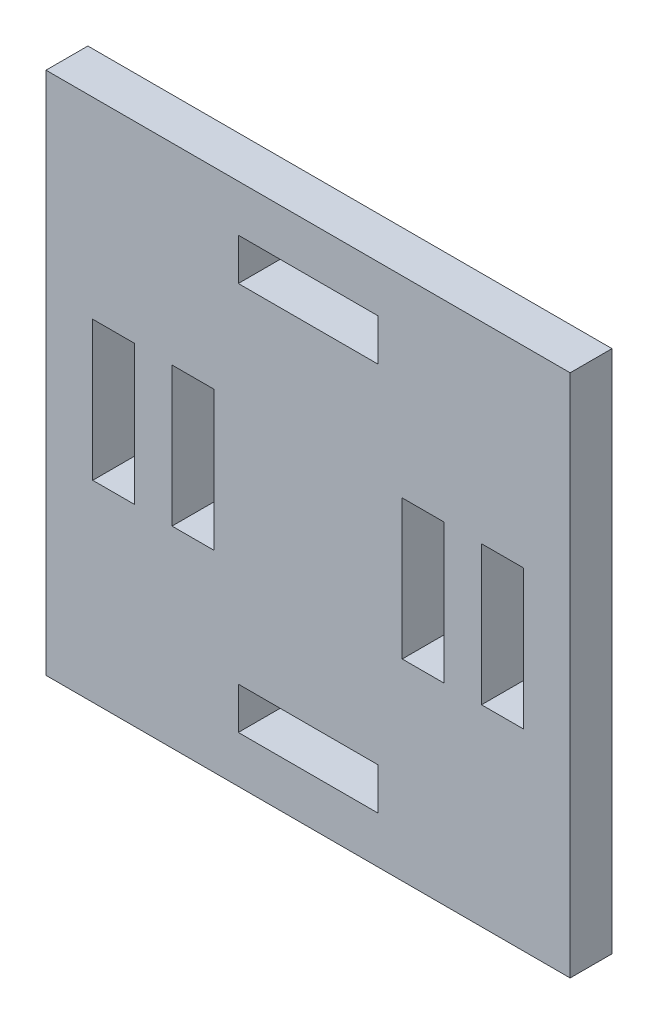
ISO-10303-21;
HEADER;
FILE_DESCRIPTION(('STEP AP214'),'2;1');
FILE_NAME('part.step','',(''),(''),'','','');
FILE_SCHEMA(('AUTOMOTIVE_DESIGN { 1 0 10303 214 1 1 1 1 }'));
ENDSEC;
DATA;
#1=APPLICATION_CONTEXT('core data for automotive mechanical design processes');
#2=APPLICATION_PROTOCOL_DEFINITION('international standard','automotive_design',2000,#1);
#3=PRODUCT_CONTEXT('',#1,'mechanical');
#4=PRODUCT('Part','Part','',(#3));
#5=PRODUCT_RELATED_PRODUCT_CATEGORY('part','',(#4));
#6=PRODUCT_DEFINITION_FORMATION('','',#4);
#7=PRODUCT_DEFINITION_CONTEXT('part definition',#1,'design');
#8=PRODUCT_DEFINITION('design','',#6,#7);
#9=PRODUCT_DEFINITION_SHAPE('','',#8);
#10=(LENGTH_UNIT() NAMED_UNIT(*) SI_UNIT(.MILLI.,.METRE.));
#11=(NAMED_UNIT(*) PLANE_ANGLE_UNIT() SI_UNIT($,.RADIAN.));
#12=(NAMED_UNIT(*) SI_UNIT($,.STERADIAN.) SOLID_ANGLE_UNIT());
#13=UNCERTAINTY_MEASURE_WITH_UNIT(LENGTH_MEASURE(1.E-05),#10,'distance_accuracy_value','');
#14=(GEOMETRIC_REPRESENTATION_CONTEXT(3) GLOBAL_UNCERTAINTY_ASSIGNED_CONTEXT((#13)) GLOBAL_UNIT_ASSIGNED_CONTEXT((#10,
#11,#12)) REPRESENTATION_CONTEXT('',''));
#15=CARTESIAN_POINT('',(0.,0.,0.));
#16=DIRECTION('',(0.,0.,1.));
#17=DIRECTION('',(1.,0.,0.));
#18=AXIS2_PLACEMENT_3D('',#15,#16,#17);
#19=CARTESIAN_POINT('',(0.,0.,3.));
#20=DIRECTION('',(0.,0.,-1.));
#21=DIRECTION('',(-1.,0.,0.));
#22=AXIS2_PLACEMENT_3D('',#19,#20,#21);
#23=PLANE('',#22);
#24=DIRECTION('',(1.,0.,0.));
#25=VECTOR('',#24,1.);
#26=CARTESIAN_POINT('',(0.,-5.,3.));
#27=LINE('',#26,#25);
#28=CARTESIAN_POINT('',(-15.435,-5.,3.));
#29=VERTEX_POINT('',#28);
#30=CARTESIAN_POINT('',(-12.435,-5.,3.));
#31=VERTEX_POINT('',#30);
#32=EDGE_CURVE('E315',#29,#31,#27,.T.);
#33=ORIENTED_EDGE('',*,*,#32,.F.);
#34=DIRECTION('',(0.,-1.,0.));
#35=VECTOR('',#34,1.);
#36=CARTESIAN_POINT('',(-15.435,1.5,3.));
#37=LINE('',#36,#35);
#38=CARTESIAN_POINT('',(-15.435,5.,3.));
#39=VERTEX_POINT('',#38);
#40=EDGE_CURVE('E576',#39,#29,#37,.T.);
#41=ORIENTED_EDGE('',*,*,#40,.F.);
#42=DIRECTION('',(1.,0.,0.));
#43=VECTOR('',#42,1.);
#44=CARTESIAN_POINT('',(0.,5.,3.));
#45=LINE('',#44,#43);
#46=CARTESIAN_POINT('',(-12.435,5.,3.));
#47=VERTEX_POINT('',#46);
#48=EDGE_CURVE('E436',#39,#47,#45,.T.);
#49=ORIENTED_EDGE('',*,*,#48,.T.);
#50=DIRECTION('',(0.,1.,0.));
#51=VECTOR('',#50,1.);
#52=CARTESIAN_POINT('',(-12.435,1.5,3.));
#53=LINE('',#52,#51);
#54=EDGE_CURVE('E551',#31,#47,#53,.T.);
#55=ORIENTED_EDGE('',*,*,#54,.F.);
#56=EDGE_LOOP('',(#33,#41,#49,#55));
#57=FACE_BOUND('',#56,.T.);
#58=DIRECTION('',(0.,-1.,0.));
#59=VECTOR('',#58,1.);
#60=CARTESIAN_POINT('',(5.00000000000001,0.,3.));
#61=LINE('',#60,#59);
#62=CARTESIAN_POINT('',(5.00000000000001,-12.435,3.));
#63=VERTEX_POINT('',#62);
#64=CARTESIAN_POINT('',(5.00000000000001,-15.435,3.));
#65=VERTEX_POINT('',#64);
#66=EDGE_CURVE('E284',#63,#65,#61,.T.);
#67=ORIENTED_EDGE('',*,*,#66,.T.);
#68=DIRECTION('',(1.,0.,0.));
#69=VECTOR('',#68,1.);
#70=CARTESIAN_POINT('',(-1.5,-15.435,3.));
#71=LINE('',#70,#69);
#72=CARTESIAN_POINT('',(-4.99999999999999,-15.435,3.));
#73=VERTEX_POINT('',#72);
#74=EDGE_CURVE('E445',#73,#65,#71,.T.);
#75=ORIENTED_EDGE('',*,*,#74,.F.);
#76=DIRECTION('',(0.,-1.,0.));
#77=VECTOR('',#76,1.);
#78=CARTESIAN_POINT('',(-4.99999999999999,0.,3.));
#79=LINE('',#78,#77);
#80=CARTESIAN_POINT('',(-4.99999999999999,-12.435,3.));
#81=VERTEX_POINT('',#80);
#82=EDGE_CURVE('E300',#81,#73,#79,.T.);
#83=ORIENTED_EDGE('',*,*,#82,.F.);
#84=DIRECTION('',(-1.,0.,0.));
#85=VECTOR('',#84,1.);
#86=CARTESIAN_POINT('',(-1.5,-12.435,3.));
#87=LINE('',#86,#85);
#88=EDGE_CURVE('E541',#63,#81,#87,.T.);
#89=ORIENTED_EDGE('',*,*,#88,.F.);
#90=EDGE_LOOP('',(#67,#75,#83,#89));
#91=FACE_BOUND('',#90,.T.);
#92=DIRECTION('',(0.,-1.,0.));
#93=VECTOR('',#92,1.);
#94=CARTESIAN_POINT('',(12.435,1.5,3.));
#95=LINE('',#94,#93);
#96=CARTESIAN_POINT('',(12.435,5.,3.));
#97=VERTEX_POINT('',#96);
#98=CARTESIAN_POINT('',(12.435,-5.,3.));
#99=VERTEX_POINT('',#98);
#100=EDGE_CURVE('E552',#97,#99,#95,.T.);
#101=ORIENTED_EDGE('',*,*,#100,.F.);
#102=DIRECTION('',(-1.,0.,0.));
#103=VECTOR('',#102,1.);
#104=CARTESIAN_POINT('',(0.,5.,3.));
#105=LINE('',#104,#103);
#106=CARTESIAN_POINT('',(15.435,5.,3.));
#107=VERTEX_POINT('',#106);
#108=EDGE_CURVE('E410',#107,#97,#105,.T.);
#109=ORIENTED_EDGE('',*,*,#108,.F.);
#110=DIRECTION('',(0.,-1.,0.));
#111=VECTOR('',#110,1.);
#112=CARTESIAN_POINT('',(15.435,1.5,3.));
#113=LINE('',#112,#111);
#114=CARTESIAN_POINT('',(15.435,-5.,3.));
#115=VERTEX_POINT('',#114);
#116=EDGE_CURVE('E580',#107,#115,#113,.T.);
#117=ORIENTED_EDGE('',*,*,#116,.T.);
#118=DIRECTION('',(-1.,0.,0.));
#119=VECTOR('',#118,1.);
#120=CARTESIAN_POINT('',(0.,-5.,3.));
#121=LINE('',#120,#119);
#122=EDGE_CURVE('E415',#115,#99,#121,.T.);
#123=ORIENTED_EDGE('',*,*,#122,.T.);
#124=EDGE_LOOP('',(#101,#109,#117,#123));
#125=FACE_BOUND('',#124,.T.);
#126=DIRECTION('',(1.,0.,0.));
#127=VECTOR('',#126,1.);
#128=CARTESIAN_POINT('',(-1.5,12.435,3.));
#129=LINE('',#128,#127);
#130=CARTESIAN_POINT('',(-4.99999999999999,12.435,3.));
#131=VERTEX_POINT('',#130);
#132=CARTESIAN_POINT('',(5.00000000000001,12.435,3.));
#133=VERTEX_POINT('',#132);
#134=EDGE_CURVE('E556',#131,#133,#129,.T.);
#135=ORIENTED_EDGE('',*,*,#134,.F.);
#136=DIRECTION('',(0.,1.,0.));
#137=VECTOR('',#136,1.);
#138=CARTESIAN_POINT('',(-4.99999999999999,0.,3.));
#139=LINE('',#138,#137);
#140=CARTESIAN_POINT('',(-4.99999999999999,15.435,3.));
#141=VERTEX_POINT('',#140);
#142=EDGE_CURVE('E320',#131,#141,#139,.T.);
#143=ORIENTED_EDGE('',*,*,#142,.T.);
#144=DIRECTION('',(1.,0.,0.));
#145=VECTOR('',#144,1.);
#146=CARTESIAN_POINT('',(-1.5,15.435,3.));
#147=LINE('',#146,#145);
#148=CARTESIAN_POINT('',(5.00000000000001,15.435,3.));
#149=VERTEX_POINT('',#148);
#150=EDGE_CURVE('E452',#141,#149,#147,.T.);
#151=ORIENTED_EDGE('',*,*,#150,.T.);
#152=DIRECTION('',(0.,1.,0.));
#153=VECTOR('',#152,1.);
#154=CARTESIAN_POINT('',(5.00000000000001,0.,3.));
#155=LINE('',#154,#153);
#156=EDGE_CURVE('E381',#133,#149,#155,.T.);
#157=ORIENTED_EDGE('',*,*,#156,.F.);
#158=EDGE_LOOP('',(#135,#143,#151,#157));
#159=FACE_BOUND('',#158,.T.);
#160=DIRECTION('',(1.,0.,0.));
#161=VECTOR('',#160,1.);
#162=CARTESIAN_POINT('',(18.785,-18.785,3.));
#163=LINE('',#162,#161);
#164=CARTESIAN_POINT('',(-18.785,-18.785,3.));
#165=VERTEX_POINT('',#164);
#166=CARTESIAN_POINT('',(18.785,-18.785,3.));
#167=VERTEX_POINT('',#166);
#168=EDGE_CURVE('E481',#165,#167,#163,.T.);
#169=ORIENTED_EDGE('',*,*,#168,.T.);
#170=DIRECTION('',(0.,1.,0.));
#171=VECTOR('',#170,1.);
#172=CARTESIAN_POINT('',(18.785,18.785,3.));
#173=LINE('',#172,#171);
#174=CARTESIAN_POINT('',(18.785,18.785,3.));
#175=VERTEX_POINT('',#174);
#176=EDGE_CURVE('E96',#167,#175,#173,.T.);
#177=ORIENTED_EDGE('',*,*,#176,.T.);
#178=DIRECTION('',(-1.,0.,0.));
#179=VECTOR('',#178,1.);
#180=CARTESIAN_POINT('',(-18.785,18.785,3.));
#181=LINE('',#180,#179);
#182=CARTESIAN_POINT('',(-18.785,18.785,3.));
#183=VERTEX_POINT('',#182);
#184=EDGE_CURVE('E490',#175,#183,#181,.T.);
#185=ORIENTED_EDGE('',*,*,#184,.T.);
#186=DIRECTION('',(0.,-1.,0.));
#187=VECTOR('',#186,1.);
#188=CARTESIAN_POINT('',(-18.785,-18.785,3.));
#189=LINE('',#188,#187);
#190=EDGE_CURVE('E65',#183,#165,#189,.T.);
#191=ORIENTED_EDGE('',*,*,#190,.T.);
#192=EDGE_LOOP('',(#169,#177,#185,#191));
#193=FACE_BOUND('',#192,.T.);
#194=DIRECTION('',(0.,-1.,0.));
#195=VECTOR('',#194,1.);
#196=CARTESIAN_POINT('',(6.75,2.5,3.));
#197=LINE('',#196,#195);
#198=CARTESIAN_POINT('',(6.75,5.,3.));
#199=VERTEX_POINT('',#198);
#200=CARTESIAN_POINT('',(6.75,-5.,3.));
#201=VERTEX_POINT('',#200);
#202=EDGE_CURVE('E254',#199,#201,#197,.T.);
#203=ORIENTED_EDGE('',*,*,#202,.F.);
#204=DIRECTION('',(-1.,0.,0.));
#205=VECTOR('',#204,1.);
#206=CARTESIAN_POINT('',(0.,5.,3.));
#207=LINE('',#206,#205);
#208=CARTESIAN_POINT('',(9.75,5.,3.));
#209=VERTEX_POINT('',#208);
#210=EDGE_CURVE('E249',#209,#199,#207,.T.);
#211=ORIENTED_EDGE('',*,*,#210,.F.);
#212=DIRECTION('',(0.,1.,0.));
#213=VECTOR('',#212,1.);
#214=CARTESIAN_POINT('',(9.75,-2.5,3.));
#215=LINE('',#214,#213);
#216=CARTESIAN_POINT('',(9.75,-5.,3.));
#217=VERTEX_POINT('',#216);
#218=EDGE_CURVE('E243',#217,#209,#215,.T.);
#219=ORIENTED_EDGE('',*,*,#218,.F.);
#220=DIRECTION('',(-1.,0.,0.));
#221=VECTOR('',#220,1.);
#222=CARTESIAN_POINT('',(0.,-5.,3.));
#223=LINE('',#222,#221);
#224=EDGE_CURVE('E247',#217,#201,#223,.T.);
#225=ORIENTED_EDGE('',*,*,#224,.T.);
#226=EDGE_LOOP('',(#203,#211,#219,#225));
#227=FACE_BOUND('',#226,.T.);
#228=DIRECTION('',(1.,0.,0.));
#229=VECTOR('',#228,1.);
#230=CARTESIAN_POINT('',(0.,-5.,3.));
#231=LINE('',#230,#229);
#232=CARTESIAN_POINT('',(-9.75,-5.,3.));
#233=VERTEX_POINT('',#232);
#234=CARTESIAN_POINT('',(-6.75,-5.,3.));
#235=VERTEX_POINT('',#234);
#236=EDGE_CURVE('E329',#233,#235,#231,.T.);
#237=ORIENTED_EDGE('',*,*,#236,.F.);
#238=DIRECTION('',(0.,-1.,0.));
#239=VECTOR('',#238,1.);
#240=CARTESIAN_POINT('',(-9.75,2.5,3.));
#241=LINE('',#240,#239);
#242=CARTESIAN_POINT('',(-9.75,5.,3.));
#243=VERTEX_POINT('',#242);
#244=EDGE_CURVE('E502',#243,#233,#241,.T.);
#245=ORIENTED_EDGE('',*,*,#244,.F.);
#246=DIRECTION('',(1.,0.,0.));
#247=VECTOR('',#246,1.);
#248=CARTESIAN_POINT('',(0.,5.,3.));
#249=LINE('',#248,#247);
#250=CARTESIAN_POINT('',(-6.75,5.,3.));
#251=VERTEX_POINT('',#250);
#252=EDGE_CURVE('E349',#243,#251,#249,.T.);
#253=ORIENTED_EDGE('',*,*,#252,.T.);
#254=DIRECTION('',(0.,1.,0.));
#255=VECTOR('',#254,1.);
#256=CARTESIAN_POINT('',(-6.75,-2.5,3.));
#257=LINE('',#256,#255);
#258=EDGE_CURVE('E507',#235,#251,#257,.T.);
#259=ORIENTED_EDGE('',*,*,#258,.F.);
#260=EDGE_LOOP('',(#237,#245,#253,#259));
#261=FACE_BOUND('',#260,.T.);
#262=ADVANCED_FACE('F47',(#57,#91,#125,#159,#193,#227,#261),#23,.F.);
#263=CARTESIAN_POINT('',(0.,0.,0.));
#264=DIRECTION('',(0.,0.,-1.));
#265=DIRECTION('',(-1.,0.,0.));
#266=AXIS2_PLACEMENT_3D('',#263,#264,#265);
#267=PLANE('',#266);
#268=DIRECTION('',(0.,1.,0.));
#269=VECTOR('',#268,1.);
#270=CARTESIAN_POINT('',(-4.99999999999999,0.,0.));
#271=LINE('',#270,#269);
#272=CARTESIAN_POINT('',(-4.99999999999999,12.435,0.));
#273=VERTEX_POINT('',#272);
#274=CARTESIAN_POINT('',(-4.99999999999999,15.435,0.));
#275=VERTEX_POINT('',#274);
#276=EDGE_CURVE('E337',#273,#275,#271,.T.);
#277=ORIENTED_EDGE('',*,*,#276,.F.);
#278=DIRECTION('',(1.,0.,0.));
#279=VECTOR('',#278,1.);
#280=CARTESIAN_POINT('',(-1.5,12.435,0.));
#281=LINE('',#280,#279);
#282=CARTESIAN_POINT('',(5.00000000000001,12.435,0.));
#283=VERTEX_POINT('',#282);
#284=EDGE_CURVE('E1011',#273,#283,#281,.T.);
#285=ORIENTED_EDGE('',*,*,#284,.T.);
#286=DIRECTION('',(0.,1.,0.));
#287=VECTOR('',#286,1.);
#288=CARTESIAN_POINT('',(5.00000000000001,0.,0.));
#289=LINE('',#288,#287);
#290=CARTESIAN_POINT('',(5.00000000000001,15.435,0.));
#291=VERTEX_POINT('',#290);
#292=EDGE_CURVE('E387',#283,#291,#289,.T.);
#293=ORIENTED_EDGE('',*,*,#292,.T.);
#294=DIRECTION('',(1.,0.,0.));
#295=VECTOR('',#294,1.);
#296=CARTESIAN_POINT('',(-1.5,15.435,0.));
#297=LINE('',#296,#295);
#298=EDGE_CURVE('E456',#275,#291,#297,.T.);
#299=ORIENTED_EDGE('',*,*,#298,.F.);
#300=EDGE_LOOP('',(#277,#285,#293,#299));
#301=FACE_BOUND('',#300,.T.);
#302=DIRECTION('',(0.,-1.,0.));
#303=VECTOR('',#302,1.);
#304=CARTESIAN_POINT('',(-15.435,1.5,0.));
#305=LINE('',#304,#303);
#306=CARTESIAN_POINT('',(-15.435,5.,0.));
#307=VERTEX_POINT('',#306);
#308=CARTESIAN_POINT('',(-15.435,-5.,0.));
#309=VERTEX_POINT('',#308);
#310=EDGE_CURVE('E457',#307,#309,#305,.T.);
#311=ORIENTED_EDGE('',*,*,#310,.T.);
#312=DIRECTION('',(1.,0.,0.));
#313=VECTOR('',#312,1.);
#314=CARTESIAN_POINT('',(0.,-5.,0.));
#315=LINE('',#314,#313);
#316=CARTESIAN_POINT('',(-12.435,-5.,0.));
#317=VERTEX_POINT('',#316);
#318=EDGE_CURVE('E321',#309,#317,#315,.T.);
#319=ORIENTED_EDGE('',*,*,#318,.T.);
#320=DIRECTION('',(0.,1.,0.));
#321=VECTOR('',#320,1.);
#322=CARTESIAN_POINT('',(-12.435,1.5,0.));
#323=LINE('',#322,#321);
#324=CARTESIAN_POINT('',(-12.435,5.,0.));
#325=VERTEX_POINT('',#324);
#326=EDGE_CURVE('E548',#317,#325,#323,.T.);
#327=ORIENTED_EDGE('',*,*,#326,.T.);
#328=DIRECTION('',(1.,0.,0.));
#329=VECTOR('',#328,1.);
#330=CARTESIAN_POINT('',(0.,5.,0.));
#331=LINE('',#330,#329);
#332=EDGE_CURVE('E440',#307,#325,#331,.T.);
#333=ORIENTED_EDGE('',*,*,#332,.F.);
#334=EDGE_LOOP('',(#311,#319,#327,#333));
#335=FACE_BOUND('',#334,.T.);
#336=DIRECTION('',(0.,-1.,0.));
#337=VECTOR('',#336,1.);
#338=CARTESIAN_POINT('',(-9.75,2.5,0.));
#339=LINE('',#338,#337);
#340=CARTESIAN_POINT('',(-9.75,5.,0.));
#341=VERTEX_POINT('',#340);
#342=CARTESIAN_POINT('',(-9.75,-5.,0.));
#343=VERTEX_POINT('',#342);
#344=EDGE_CURVE('E485',#341,#343,#339,.T.);
#345=ORIENTED_EDGE('',*,*,#344,.T.);
#346=DIRECTION('',(1.,0.,0.));
#347=VECTOR('',#346,1.);
#348=CARTESIAN_POINT('',(0.,-5.,0.));
#349=LINE('',#348,#347);
#350=CARTESIAN_POINT('',(-6.75,-5.,0.));
#351=VERTEX_POINT('',#350);
#352=EDGE_CURVE('E371',#343,#351,#349,.T.);
#353=ORIENTED_EDGE('',*,*,#352,.T.);
#354=DIRECTION('',(0.,1.,0.));
#355=VECTOR('',#354,1.);
#356=CARTESIAN_POINT('',(-6.75,-2.5,0.));
#357=LINE('',#356,#355);
#358=CARTESIAN_POINT('',(-6.75,5.,0.));
#359=VERTEX_POINT('',#358);
#360=EDGE_CURVE('E510',#351,#359,#357,.T.);
#361=ORIENTED_EDGE('',*,*,#360,.T.);
#362=DIRECTION('',(1.,0.,0.));
#363=VECTOR('',#362,1.);
#364=CARTESIAN_POINT('',(0.,5.,0.));
#365=LINE('',#364,#363);
#366=EDGE_CURVE('E353',#341,#359,#365,.T.);
#367=ORIENTED_EDGE('',*,*,#366,.F.);
#368=EDGE_LOOP('',(#345,#353,#361,#367));
#369=FACE_BOUND('',#368,.T.);
#370=DIRECTION('',(-1.,0.,0.));
#371=VECTOR('',#370,1.);
#372=CARTESIAN_POINT('',(0.,5.,0.));
#373=LINE('',#372,#371);
#374=CARTESIAN_POINT('',(9.75,5.,0.));
#375=VERTEX_POINT('',#374);
#376=CARTESIAN_POINT('',(6.75,5.,0.));
#377=VERTEX_POINT('',#376);
#378=EDGE_CURVE('E399',#375,#377,#373,.T.);
#379=ORIENTED_EDGE('',*,*,#378,.T.);
#380=DIRECTION('',(0.,-1.,0.));
#381=VECTOR('',#380,1.);
#382=CARTESIAN_POINT('',(6.75,2.5,0.));
#383=LINE('',#382,#381);
#384=CARTESIAN_POINT('',(6.75,-5.,0.));
#385=VERTEX_POINT('',#384);
#386=EDGE_CURVE('E255',#377,#385,#383,.T.);
#387=ORIENTED_EDGE('',*,*,#386,.T.);
#388=DIRECTION('',(-1.,0.,0.));
#389=VECTOR('',#388,1.);
#390=CARTESIAN_POINT('',(0.,-5.,0.));
#391=LINE('',#390,#389);
#392=CARTESIAN_POINT('',(9.75,-5.,0.));
#393=VERTEX_POINT('',#392);
#394=EDGE_CURVE('E278',#393,#385,#391,.T.);
#395=ORIENTED_EDGE('',*,*,#394,.F.);
#396=DIRECTION('',(0.,1.,0.));
#397=VECTOR('',#396,1.);
#398=CARTESIAN_POINT('',(9.75,-2.5,0.));
#399=LINE('',#398,#397);
#400=EDGE_CURVE('E260',#393,#375,#399,.T.);
#401=ORIENTED_EDGE('',*,*,#400,.T.);
#402=EDGE_LOOP('',(#379,#387,#395,#401));
#403=FACE_BOUND('',#402,.T.);
#404=DIRECTION('',(-1.,0.,0.));
#405=VECTOR('',#404,1.);
#406=CARTESIAN_POINT('',(0.,5.,0.));
#407=LINE('',#406,#405);
#408=CARTESIAN_POINT('',(15.435,5.,0.));
#409=VERTEX_POINT('',#408);
#410=CARTESIAN_POINT('',(12.435,5.,0.));
#411=VERTEX_POINT('',#410);
#412=EDGE_CURVE('E414',#409,#411,#407,.T.);
#413=ORIENTED_EDGE('',*,*,#412,.T.);
#414=DIRECTION('',(0.,-1.,0.));
#415=VECTOR('',#414,1.);
#416=CARTESIAN_POINT('',(12.435,1.5,0.));
#417=LINE('',#416,#415);
#418=CARTESIAN_POINT('',(12.435,-5.,0.));
#419=VERTEX_POINT('',#418);
#420=EDGE_CURVE('E546',#411,#419,#417,.T.);
#421=ORIENTED_EDGE('',*,*,#420,.T.);
#422=DIRECTION('',(-1.,0.,0.));
#423=VECTOR('',#422,1.);
#424=CARTESIAN_POINT('',(0.,-5.,0.));
#425=LINE('',#424,#423);
#426=CARTESIAN_POINT('',(15.435,-5.,0.));
#427=VERTEX_POINT('',#426);
#428=EDGE_CURVE('E271',#427,#419,#425,.T.);
#429=ORIENTED_EDGE('',*,*,#428,.F.);
#430=DIRECTION('',(0.,-1.,0.));
#431=VECTOR('',#430,1.);
#432=CARTESIAN_POINT('',(15.435,1.5,0.));
#433=LINE('',#432,#431);
#434=EDGE_CURVE('E581',#409,#427,#433,.T.);
#435=ORIENTED_EDGE('',*,*,#434,.F.);
#436=EDGE_LOOP('',(#413,#421,#429,#435));
#437=FACE_BOUND('',#436,.T.);
#438=DIRECTION('',(1.,0.,0.));
#439=VECTOR('',#438,1.);
#440=CARTESIAN_POINT('',(-1.5,-15.435,0.));
#441=LINE('',#440,#439);
#442=CARTESIAN_POINT('',(-4.99999999999999,-15.435,0.));
#443=VERTEX_POINT('',#442);
#444=CARTESIAN_POINT('',(5.00000000000001,-15.435,0.));
#445=VERTEX_POINT('',#444);
#446=EDGE_CURVE('E584',#443,#445,#441,.T.);
#447=ORIENTED_EDGE('',*,*,#446,.T.);
#448=DIRECTION('',(0.,-1.,0.));
#449=VECTOR('',#448,1.);
#450=CARTESIAN_POINT('',(5.00000000000001,0.,0.));
#451=LINE('',#450,#449);
#452=CARTESIAN_POINT('',(5.00000000000001,-12.435,0.));
#453=VERTEX_POINT('',#452);
#454=EDGE_CURVE('E280',#453,#445,#451,.T.);
#455=ORIENTED_EDGE('',*,*,#454,.F.);
#456=DIRECTION('',(-1.,0.,0.));
#457=VECTOR('',#456,1.);
#458=CARTESIAN_POINT('',(-1.5,-12.435,0.));
#459=LINE('',#458,#457);
#460=CARTESIAN_POINT('',(-4.99999999999999,-12.435,0.));
#461=VERTEX_POINT('',#460);
#462=EDGE_CURVE('E547',#453,#461,#459,.T.);
#463=ORIENTED_EDGE('',*,*,#462,.T.);
#464=DIRECTION('',(0.,-1.,0.));
#465=VECTOR('',#464,1.);
#466=CARTESIAN_POINT('',(-4.99999999999999,0.,0.));
#467=LINE('',#466,#465);
#468=EDGE_CURVE('E305',#461,#443,#467,.T.);
#469=ORIENTED_EDGE('',*,*,#468,.T.);
#470=EDGE_LOOP('',(#447,#455,#463,#469));
#471=FACE_BOUND('',#470,.T.);
#472=DIRECTION('',(1.,0.,0.));
#473=VECTOR('',#472,1.);
#474=CARTESIAN_POINT('',(18.785,-18.785,0.));
#475=LINE('',#474,#473);
#476=CARTESIAN_POINT('',(-18.785,-18.785,0.));
#477=VERTEX_POINT('',#476);
#478=CARTESIAN_POINT('',(18.785,-18.785,0.));
#479=VERTEX_POINT('',#478);
#480=EDGE_CURVE('E506',#477,#479,#475,.T.);
#481=ORIENTED_EDGE('',*,*,#480,.F.);
#482=DIRECTION('',(0.,-1.,0.));
#483=VECTOR('',#482,1.);
#484=CARTESIAN_POINT('',(-18.785,-18.785,0.));
#485=LINE('',#484,#483);
#486=CARTESIAN_POINT('',(-18.785,18.785,0.));
#487=VERTEX_POINT('',#486);
#488=EDGE_CURVE('E89',#487,#477,#485,.T.);
#489=ORIENTED_EDGE('',*,*,#488,.F.);
#490=DIRECTION('',(-1.,0.,0.));
#491=VECTOR('',#490,1.);
#492=CARTESIAN_POINT('',(-18.785,18.785,0.));
#493=LINE('',#492,#491);
#494=CARTESIAN_POINT('',(18.785,18.785,0.));
#495=VERTEX_POINT('',#494);
#496=EDGE_CURVE('E83',#495,#487,#493,.T.);
#497=ORIENTED_EDGE('',*,*,#496,.F.);
#498=DIRECTION('',(0.,1.,0.));
#499=VECTOR('',#498,1.);
#500=CARTESIAN_POINT('',(18.785,18.785,0.));
#501=LINE('',#500,#499);
#502=EDGE_CURVE('E651',#479,#495,#501,.T.);
#503=ORIENTED_EDGE('',*,*,#502,.F.);
#504=EDGE_LOOP('',(#481,#489,#497,#503));
#505=FACE_BOUND('',#504,.T.);
#506=ADVANCED_FACE('F611',(#301,#335,#369,#403,#437,#471,#505),#267,.T.);
#507=CARTESIAN_POINT('',(18.785,-18.785,3.));
#508=DIRECTION('',(0.,1.,0.));
#509=DIRECTION('',(0.,0.,1.));
#510=AXIS2_PLACEMENT_3D('',#507,#508,#509);
#511=PLANE('',#510);
#512=ORIENTED_EDGE('',*,*,#480,.T.);
#513=DIRECTION('',(0.,0.,-1.));
#514=VECTOR('',#513,1.);
#515=CARTESIAN_POINT('',(18.785,-18.785,3.));
#516=LINE('',#515,#514);
#517=EDGE_CURVE('E12',#167,#479,#516,.T.);
#518=ORIENTED_EDGE('',*,*,#517,.F.);
#519=ORIENTED_EDGE('',*,*,#168,.F.);
#520=DIRECTION('',(0.,0.,-1.));
#521=VECTOR('',#520,1.);
#522=CARTESIAN_POINT('',(-18.785,-18.785,3.));
#523=LINE('',#522,#521);
#524=EDGE_CURVE('E665',#165,#477,#523,.T.);
#525=ORIENTED_EDGE('',*,*,#524,.T.);
#526=EDGE_LOOP('',(#512,#518,#519,#525));
#527=FACE_BOUND('',#526,.T.);
#528=ADVANCED_FACE('F49',(#527),#511,.F.);
#529=CARTESIAN_POINT('',(18.785,18.785,3.));
#530=DIRECTION('',(-1.,0.,0.));
#531=DIRECTION('',(0.,0.,1.));
#532=AXIS2_PLACEMENT_3D('',#529,#530,#531);
#533=PLANE('',#532);
#534=ORIENTED_EDGE('',*,*,#502,.T.);
#535=DIRECTION('',(0.,0.,-1.));
#536=VECTOR('',#535,1.);
#537=CARTESIAN_POINT('',(18.785,18.785,3.));
#538=LINE('',#537,#536);
#539=EDGE_CURVE('E57',#175,#495,#538,.T.);
#540=ORIENTED_EDGE('',*,*,#539,.F.);
#541=ORIENTED_EDGE('',*,*,#176,.F.);
#542=ORIENTED_EDGE('',*,*,#517,.T.);
#543=EDGE_LOOP('',(#534,#540,#541,#542));
#544=FACE_BOUND('',#543,.T.);
#545=ADVANCED_FACE('F645',(#544),#533,.F.);
#546=CARTESIAN_POINT('',(-18.785,18.785,3.));
#547=DIRECTION('',(0.,-1.,0.));
#548=DIRECTION('',(0.,0.,-1.));
#549=AXIS2_PLACEMENT_3D('',#546,#547,#548);
#550=PLANE('',#549);
#551=ORIENTED_EDGE('',*,*,#496,.T.);
#552=DIRECTION('',(0.,0.,-1.));
#553=VECTOR('',#552,1.);
#554=CARTESIAN_POINT('',(-18.785,18.785,3.));
#555=LINE('',#554,#553);
#556=EDGE_CURVE('E659',#183,#487,#555,.T.);
#557=ORIENTED_EDGE('',*,*,#556,.F.);
#558=ORIENTED_EDGE('',*,*,#184,.F.);
#559=ORIENTED_EDGE('',*,*,#539,.T.);
#560=EDGE_LOOP('',(#551,#557,#558,#559));
#561=FACE_BOUND('',#560,.T.);
#562=ADVANCED_FACE('F643',(#561),#550,.F.);
#563=CARTESIAN_POINT('',(-18.785,-18.785,3.));
#564=DIRECTION('',(1.,0.,0.));
#565=DIRECTION('',(0.,0.,-1.));
#566=AXIS2_PLACEMENT_3D('',#563,#564,#565);
#567=PLANE('',#566);
#568=ORIENTED_EDGE('',*,*,#488,.T.);
#569=ORIENTED_EDGE('',*,*,#524,.F.);
#570=ORIENTED_EDGE('',*,*,#190,.F.);
#571=ORIENTED_EDGE('',*,*,#556,.T.);
#572=EDGE_LOOP('',(#568,#569,#570,#571));
#573=FACE_BOUND('',#572,.T.);
#574=ADVANCED_FACE('F641',(#573),#567,.F.);
#575=CARTESIAN_POINT('',(-6.75,-2.5,3.));
#576=DIRECTION('',(-1.,0.,0.));
#577=DIRECTION('',(0.,0.,1.));
#578=AXIS2_PLACEMENT_3D('',#575,#576,#577);
#579=PLANE('',#578);
#580=ORIENTED_EDGE('',*,*,#360,.F.);
#581=DIRECTION('',(0.,0.,1.));
#582=VECTOR('',#581,1.);
#583=CARTESIAN_POINT('',(-6.75,-5.,-4.60977222864646));
#584=LINE('',#583,#582);
#585=EDGE_CURVE('E366',#351,#235,#584,.T.);
#586=ORIENTED_EDGE('',*,*,#585,.T.);
#587=ORIENTED_EDGE('',*,*,#258,.T.);
#588=DIRECTION('',(0.,0.,1.));
#589=VECTOR('',#588,1.);
#590=CARTESIAN_POINT('',(-6.75,5.,-4.60977222864646));
#591=LINE('',#590,#589);
#592=EDGE_CURVE('E362',#359,#251,#591,.T.);
#593=ORIENTED_EDGE('',*,*,#592,.F.);
#594=EDGE_LOOP('',(#580,#586,#587,#593));
#595=FACE_BOUND('',#594,.T.);
#596=ADVANCED_FACE('F638',(#595),#579,.T.);
#597=CARTESIAN_POINT('',(-9.75,2.5,3.));
#598=DIRECTION('',(1.,0.,0.));
#599=DIRECTION('',(0.,0.,-1.));
#600=AXIS2_PLACEMENT_3D('',#597,#598,#599);
#601=PLANE('',#600);
#602=ORIENTED_EDGE('',*,*,#344,.F.);
#603=DIRECTION('',(0.,0.,1.));
#604=VECTOR('',#603,1.);
#605=CARTESIAN_POINT('',(-9.75,5.,-4.60977222864646));
#606=LINE('',#605,#604);
#607=EDGE_CURVE('E354',#341,#243,#606,.T.);
#608=ORIENTED_EDGE('',*,*,#607,.T.);
#609=ORIENTED_EDGE('',*,*,#244,.T.);
#610=DIRECTION('',(0.,0.,1.));
#611=VECTOR('',#610,1.);
#612=CARTESIAN_POINT('',(-9.75,-5.,-4.60977222864646));
#613=LINE('',#612,#611);
#614=EDGE_CURVE('E370',#343,#233,#613,.T.);
#615=ORIENTED_EDGE('',*,*,#614,.F.);
#616=EDGE_LOOP('',(#602,#608,#609,#615));
#617=FACE_BOUND('',#616,.T.);
#618=ADVANCED_FACE('F682',(#617),#601,.T.);
#619=CARTESIAN_POINT('',(9.75,-2.5,3.));
#620=DIRECTION('',(-1.,0.,0.));
#621=DIRECTION('',(0.,0.,1.));
#622=AXIS2_PLACEMENT_3D('',#619,#620,#621);
#623=PLANE('',#622);
#624=ORIENTED_EDGE('',*,*,#400,.F.);
#625=DIRECTION('',(0.,0.,1.));
#626=VECTOR('',#625,1.);
#627=CARTESIAN_POINT('',(9.75,-5.,-4.60977222864646));
#628=LINE('',#627,#626);
#629=EDGE_CURVE('E258',#393,#217,#628,.T.);
#630=ORIENTED_EDGE('',*,*,#629,.T.);
#631=ORIENTED_EDGE('',*,*,#218,.T.);
#632=DIRECTION('',(0.,0.,1.));
#633=VECTOR('',#632,1.);
#634=CARTESIAN_POINT('',(9.75,5.,-4.60977222864646));
#635=LINE('',#634,#633);
#636=EDGE_CURVE('E386',#375,#209,#635,.T.);
#637=ORIENTED_EDGE('',*,*,#636,.F.);
#638=EDGE_LOOP('',(#624,#630,#631,#637));
#639=FACE_BOUND('',#638,.T.);
#640=ADVANCED_FACE('F259',(#639),#623,.T.);
#641=CARTESIAN_POINT('',(6.75,2.5,3.));
#642=DIRECTION('',(1.,0.,0.));
#643=DIRECTION('',(0.,0.,-1.));
#644=AXIS2_PLACEMENT_3D('',#641,#642,#643);
#645=PLANE('',#644);
#646=ORIENTED_EDGE('',*,*,#386,.F.);
#647=DIRECTION('',(0.,0.,1.));
#648=VECTOR('',#647,1.);
#649=CARTESIAN_POINT('',(6.75,5.,-4.60977222864646));
#650=LINE('',#649,#648);
#651=EDGE_CURVE('E404',#377,#199,#650,.T.);
#652=ORIENTED_EDGE('',*,*,#651,.T.);
#653=ORIENTED_EDGE('',*,*,#202,.T.);
#654=DIRECTION('',(0.,0.,1.));
#655=VECTOR('',#654,1.);
#656=CARTESIAN_POINT('',(6.75,-5.,-4.60977222864646));
#657=LINE('',#656,#655);
#658=EDGE_CURVE('E265',#385,#201,#657,.T.);
#659=ORIENTED_EDGE('',*,*,#658,.F.);
#660=EDGE_LOOP('',(#646,#652,#653,#659));
#661=FACE_BOUND('',#660,.T.);
#662=ADVANCED_FACE('F740',(#661),#645,.T.);
#663=CARTESIAN_POINT('',(-1.5,12.435,-3.04708554072732));
#664=DIRECTION('',(0.,-1.,0.));
#665=DIRECTION('',(0.,0.,-1.));
#666=AXIS2_PLACEMENT_3D('',#663,#664,#665);
#667=PLANE('',#666);
#668=ORIENTED_EDGE('',*,*,#284,.F.);
#669=DIRECTION('',(0.,0.,1.));
#670=VECTOR('',#669,1.);
#671=CARTESIAN_POINT('',(-4.99999999999999,12.435,-4.60977222864646));
#672=LINE('',#671,#670);
#673=EDGE_CURVE('E336',#273,#131,#672,.T.);
#674=ORIENTED_EDGE('',*,*,#673,.T.);
#675=ORIENTED_EDGE('',*,*,#134,.T.);
#676=DIRECTION('',(0.,0.,1.));
#677=VECTOR('',#676,1.);
#678=CARTESIAN_POINT('',(5.00000000000001,12.435,-4.60977222864646));
#679=LINE('',#678,#677);
#680=EDGE_CURVE('E385',#283,#133,#679,.T.);
#681=ORIENTED_EDGE('',*,*,#680,.F.);
#682=EDGE_LOOP('',(#668,#674,#675,#681));
#683=FACE_BOUND('',#682,.T.);
#684=ADVANCED_FACE('F733',(#683),#667,.F.);
#685=CARTESIAN_POINT('',(-12.435,1.5,-3.04708554072732));
#686=DIRECTION('',(1.,0.,0.));
#687=DIRECTION('',(0.,0.,-1.));
#688=AXIS2_PLACEMENT_3D('',#685,#686,#687);
#689=PLANE('',#688);
#690=ORIENTED_EDGE('',*,*,#326,.F.);
#691=DIRECTION('',(0.,0.,1.));
#692=VECTOR('',#691,1.);
#693=CARTESIAN_POINT('',(-12.435,-5.,-4.60977222864646));
#694=LINE('',#693,#692);
#695=EDGE_CURVE('E325',#317,#31,#694,.T.);
#696=ORIENTED_EDGE('',*,*,#695,.T.);
#697=ORIENTED_EDGE('',*,*,#54,.T.);
#698=DIRECTION('',(0.,0.,1.));
#699=VECTOR('',#698,1.);
#700=CARTESIAN_POINT('',(-12.435,5.,-4.60977222864646));
#701=LINE('',#700,#699);
#702=EDGE_CURVE('E358',#325,#47,#701,.T.);
#703=ORIENTED_EDGE('',*,*,#702,.F.);
#704=EDGE_LOOP('',(#690,#696,#697,#703));
#705=FACE_BOUND('',#704,.T.);
#706=ADVANCED_FACE('F730',(#705),#689,.F.);
#707=CARTESIAN_POINT('',(12.435,1.5,-3.04708554072732));
#708=DIRECTION('',(-1.,0.,0.));
#709=DIRECTION('',(0.,0.,1.));
#710=AXIS2_PLACEMENT_3D('',#707,#708,#709);
#711=PLANE('',#710);
#712=ORIENTED_EDGE('',*,*,#420,.F.);
#713=DIRECTION('',(0.,0.,1.));
#714=VECTOR('',#713,1.);
#715=CARTESIAN_POINT('',(12.435,5.,-4.60977222864646));
#716=LINE('',#715,#714);
#717=EDGE_CURVE('E419',#411,#97,#716,.T.);
#718=ORIENTED_EDGE('',*,*,#717,.T.);
#719=ORIENTED_EDGE('',*,*,#100,.T.);
#720=DIRECTION('',(0.,0.,1.));
#721=VECTOR('',#720,1.);
#722=CARTESIAN_POINT('',(12.435,-5.,-4.60977222864646));
#723=LINE('',#722,#721);
#724=EDGE_CURVE('E275',#419,#99,#723,.T.);
#725=ORIENTED_EDGE('',*,*,#724,.F.);
#726=EDGE_LOOP('',(#712,#718,#719,#725));
#727=FACE_BOUND('',#726,.T.);
#728=ADVANCED_FACE('F729',(#727),#711,.F.);
#729=CARTESIAN_POINT('',(-1.5,-12.435,-3.04708554072732));
#730=DIRECTION('',(0.,1.,0.));
#731=DIRECTION('',(0.,0.,1.));
#732=AXIS2_PLACEMENT_3D('',#729,#730,#731);
#733=PLANE('',#732);
#734=ORIENTED_EDGE('',*,*,#462,.F.);
#735=DIRECTION('',(0.,0.,1.));
#736=VECTOR('',#735,1.);
#737=CARTESIAN_POINT('',(5.00000000000001,-12.435,-4.60977222864646));
#738=LINE('',#737,#736);
#739=EDGE_CURVE('E289',#453,#63,#738,.T.);
#740=ORIENTED_EDGE('',*,*,#739,.T.);
#741=ORIENTED_EDGE('',*,*,#88,.T.);
#742=DIRECTION('',(0.,0.,1.));
#743=VECTOR('',#742,1.);
#744=CARTESIAN_POINT('',(-4.99999999999999,-12.435,-4.60977222864646));
#745=LINE('',#744,#743);
#746=EDGE_CURVE('E304',#461,#81,#745,.T.);
#747=ORIENTED_EDGE('',*,*,#746,.F.);
#748=EDGE_LOOP('',(#734,#740,#741,#747));
#749=FACE_BOUND('',#748,.T.);
#750=ADVANCED_FACE('F609',(#749),#733,.F.);
#751=CARTESIAN_POINT('',(-1.5,15.435,-3.02034766210779));
#752=DIRECTION('',(0.,-1.,0.));
#753=DIRECTION('',(0.,0.,-1.));
#754=AXIS2_PLACEMENT_3D('',#751,#752,#753);
#755=PLANE('',#754);
#756=ORIENTED_EDGE('',*,*,#150,.F.);
#757=DIRECTION('',(0.,0.,1.));
#758=VECTOR('',#757,1.);
#759=CARTESIAN_POINT('',(-4.99999999999999,15.435,-4.60977222864646));
#760=LINE('',#759,#758);
#761=EDGE_CURVE('E341',#275,#141,#760,.T.);
#762=ORIENTED_EDGE('',*,*,#761,.F.);
#763=ORIENTED_EDGE('',*,*,#298,.T.);
#764=DIRECTION('',(0.,0.,1.));
#765=VECTOR('',#764,1.);
#766=CARTESIAN_POINT('',(5.00000000000001,15.435,-4.60977222864646));
#767=LINE('',#766,#765);
#768=EDGE_CURVE('E342',#291,#149,#767,.T.);
#769=ORIENTED_EDGE('',*,*,#768,.T.);
#770=EDGE_LOOP('',(#756,#762,#763,#769));
#771=FACE_BOUND('',#770,.T.);
#772=ADVANCED_FACE('F716',(#771),#755,.T.);
#773=CARTESIAN_POINT('',(-15.435,1.5,-3.02034766210779));
#774=DIRECTION('',(-1.,0.,0.));
#775=DIRECTION('',(0.,0.,1.));
#776=AXIS2_PLACEMENT_3D('',#773,#774,#775);
#777=PLANE('',#776);
#778=ORIENTED_EDGE('',*,*,#310,.F.);
#779=DIRECTION('',(0.,0.,1.));
#780=VECTOR('',#779,1.);
#781=CARTESIAN_POINT('',(-15.435,5.,-4.60977222864646));
#782=LINE('',#781,#780);
#783=EDGE_CURVE('E441',#307,#39,#782,.T.);
#784=ORIENTED_EDGE('',*,*,#783,.T.);
#785=ORIENTED_EDGE('',*,*,#40,.T.);
#786=DIRECTION('',(0.,0.,1.));
#787=VECTOR('',#786,1.);
#788=CARTESIAN_POINT('',(-15.435,-5.,-4.60977222864646));
#789=LINE('',#788,#787);
#790=EDGE_CURVE('E319',#309,#29,#789,.T.);
#791=ORIENTED_EDGE('',*,*,#790,.F.);
#792=EDGE_LOOP('',(#778,#784,#785,#791));
#793=FACE_BOUND('',#792,.T.);
#794=ADVANCED_FACE('F719',(#793),#777,.F.);
#795=CARTESIAN_POINT('',(15.435,1.5,-3.02034766210779));
#796=DIRECTION('',(-1.,0.,0.));
#797=DIRECTION('',(0.,0.,1.));
#798=AXIS2_PLACEMENT_3D('',#795,#796,#797);
#799=PLANE('',#798);
#800=ORIENTED_EDGE('',*,*,#116,.F.);
#801=DIRECTION('',(0.,0.,1.));
#802=VECTOR('',#801,1.);
#803=CARTESIAN_POINT('',(15.435,5.,-4.60977222864646));
#804=LINE('',#803,#802);
#805=EDGE_CURVE('E400',#409,#107,#804,.T.);
#806=ORIENTED_EDGE('',*,*,#805,.F.);
#807=ORIENTED_EDGE('',*,*,#434,.T.);
#808=DIRECTION('',(0.,0.,1.));
#809=VECTOR('',#808,1.);
#810=CARTESIAN_POINT('',(15.435,-5.,-4.60977222864646));
#811=LINE('',#810,#809);
#812=EDGE_CURVE('E428',#427,#115,#811,.T.);
#813=ORIENTED_EDGE('',*,*,#812,.T.);
#814=EDGE_LOOP('',(#800,#806,#807,#813));
#815=FACE_BOUND('',#814,.T.);
#816=ADVANCED_FACE('F624',(#815),#799,.T.);
#817=CARTESIAN_POINT('',(-1.5,-15.435,-3.02034766210779));
#818=DIRECTION('',(0.,-1.,0.));
#819=DIRECTION('',(0.,0.,-1.));
#820=AXIS2_PLACEMENT_3D('',#817,#818,#819);
#821=PLANE('',#820);
#822=ORIENTED_EDGE('',*,*,#446,.F.);
#823=DIRECTION('',(0.,0.,1.));
#824=VECTOR('',#823,1.);
#825=CARTESIAN_POINT('',(-4.99999999999999,-15.435,-4.60977222864646));
#826=LINE('',#825,#824);
#827=EDGE_CURVE('E299',#443,#73,#826,.T.);
#828=ORIENTED_EDGE('',*,*,#827,.T.);
#829=ORIENTED_EDGE('',*,*,#74,.T.);
#830=DIRECTION('',(0.,0.,1.));
#831=VECTOR('',#830,1.);
#832=CARTESIAN_POINT('',(5.00000000000001,-15.435,-4.60977222864646));
#833=LINE('',#832,#831);
#834=EDGE_CURVE('E288',#445,#65,#833,.T.);
#835=ORIENTED_EDGE('',*,*,#834,.F.);
#836=EDGE_LOOP('',(#822,#828,#829,#835));
#837=FACE_BOUND('',#836,.T.);
#838=ADVANCED_FACE('F597',(#837),#821,.F.);
#839=CARTESIAN_POINT('',(-4.99999999999999,0.,-4.60977222864646));
#840=DIRECTION('',(-1.,0.,0.));
#841=DIRECTION('',(0.,0.,1.));
#842=AXIS2_PLACEMENT_3D('',#839,#840,#841);
#843=PLANE('',#842);
#844=ORIENTED_EDGE('',*,*,#746,.T.);
#845=ORIENTED_EDGE('',*,*,#82,.T.);
#846=ORIENTED_EDGE('',*,*,#827,.F.);
#847=ORIENTED_EDGE('',*,*,#468,.F.);
#848=EDGE_LOOP('',(#844,#845,#846,#847));
#849=FACE_BOUND('',#848,.T.);
#850=ADVANCED_FACE('F615',(#849),#843,.F.);
#851=CARTESIAN_POINT('',(5.00000000000001,0.,-4.60977222864646));
#852=DIRECTION('',(-1.,0.,0.));
#853=DIRECTION('',(0.,-1.,0.));
#854=AXIS2_PLACEMENT_3D('',#851,#852,#853);
#855=PLANE('',#854);
#856=ORIENTED_EDGE('',*,*,#454,.T.);
#857=ORIENTED_EDGE('',*,*,#834,.T.);
#858=ORIENTED_EDGE('',*,*,#66,.F.);
#859=ORIENTED_EDGE('',*,*,#739,.F.);
#860=EDGE_LOOP('',(#856,#857,#858,#859));
#861=FACE_BOUND('',#860,.T.);
#862=ADVANCED_FACE('F603',(#861),#855,.T.);
#863=CARTESIAN_POINT('',(0.,-5.,-4.60977222864646));
#864=DIRECTION('',(0.,1.,0.));
#865=DIRECTION('',(-1.,0.,0.));
#866=AXIS2_PLACEMENT_3D('',#863,#864,#865);
#867=PLANE('',#866);
#868=ORIENTED_EDGE('',*,*,#428,.T.);
#869=ORIENTED_EDGE('',*,*,#724,.T.);
#870=ORIENTED_EDGE('',*,*,#122,.F.);
#871=ORIENTED_EDGE('',*,*,#812,.F.);
#872=EDGE_LOOP('',(#868,#869,#870,#871));
#873=FACE_BOUND('',#872,.T.);
#874=ADVANCED_FACE('F622',(#873),#867,.T.);
#875=CARTESIAN_POINT('',(0.,5.,-4.60977222864646));
#876=DIRECTION('',(0.,1.,0.));
#877=DIRECTION('',(-1.,0.,0.));
#878=AXIS2_PLACEMENT_3D('',#875,#876,#877);
#879=PLANE('',#878);
#880=ORIENTED_EDGE('',*,*,#805,.T.);
#881=ORIENTED_EDGE('',*,*,#108,.T.);
#882=ORIENTED_EDGE('',*,*,#717,.F.);
#883=ORIENTED_EDGE('',*,*,#412,.F.);
#884=EDGE_LOOP('',(#880,#881,#882,#883));
#885=FACE_BOUND('',#884,.T.);
#886=ADVANCED_FACE('F705',(#885),#879,.F.);
#887=CARTESIAN_POINT('',(0.,5.,-4.60977222864646));
#888=DIRECTION('',(0.,-1.,0.));
#889=DIRECTION('',(1.,0.,0.));
#890=AXIS2_PLACEMENT_3D('',#887,#888,#889);
#891=PLANE('',#890);
#892=ORIENTED_EDGE('',*,*,#332,.T.);
#893=ORIENTED_EDGE('',*,*,#702,.T.);
#894=ORIENTED_EDGE('',*,*,#48,.F.);
#895=ORIENTED_EDGE('',*,*,#783,.F.);
#896=EDGE_LOOP('',(#892,#893,#894,#895));
#897=FACE_BOUND('',#896,.T.);
#898=ADVANCED_FACE('F708',(#897),#891,.T.);
#899=CARTESIAN_POINT('',(0.,-5.,-4.60977222864646));
#900=DIRECTION('',(0.,-1.,0.));
#901=DIRECTION('',(1.,0.,0.));
#902=AXIS2_PLACEMENT_3D('',#899,#900,#901);
#903=PLANE('',#902);
#904=ORIENTED_EDGE('',*,*,#790,.T.);
#905=ORIENTED_EDGE('',*,*,#32,.T.);
#906=ORIENTED_EDGE('',*,*,#695,.F.);
#907=ORIENTED_EDGE('',*,*,#318,.F.);
#908=EDGE_LOOP('',(#904,#905,#906,#907));
#909=FACE_BOUND('',#908,.T.);
#910=ADVANCED_FACE('F700',(#909),#903,.F.);
#911=CARTESIAN_POINT('',(5.00000000000001,0.,-4.60977222864646));
#912=DIRECTION('',(1.,0.,0.));
#913=DIRECTION('',(0.,1.,0.));
#914=AXIS2_PLACEMENT_3D('',#911,#912,#913);
#915=PLANE('',#914);
#916=ORIENTED_EDGE('',*,*,#680,.T.);
#917=ORIENTED_EDGE('',*,*,#156,.T.);
#918=ORIENTED_EDGE('',*,*,#768,.F.);
#919=ORIENTED_EDGE('',*,*,#292,.F.);
#920=EDGE_LOOP('',(#916,#917,#918,#919));
#921=FACE_BOUND('',#920,.T.);
#922=ADVANCED_FACE('F696',(#921),#915,.F.);
#923=CARTESIAN_POINT('',(-4.99999999999999,0.,-4.60977222864646));
#924=DIRECTION('',(1.,0.,0.));
#925=DIRECTION('',(0.,0.,-1.));
#926=AXIS2_PLACEMENT_3D('',#923,#924,#925);
#927=PLANE('',#926);
#928=ORIENTED_EDGE('',*,*,#276,.T.);
#929=ORIENTED_EDGE('',*,*,#761,.T.);
#930=ORIENTED_EDGE('',*,*,#142,.F.);
#931=ORIENTED_EDGE('',*,*,#673,.F.);
#932=EDGE_LOOP('',(#928,#929,#930,#931));
#933=FACE_BOUND('',#932,.T.);
#934=ADVANCED_FACE('F699',(#933),#927,.T.);
#935=CARTESIAN_POINT('',(0.,-5.,-4.60977222864646));
#936=DIRECTION('',(0.,1.,0.));
#937=DIRECTION('',(0.,0.,1.));
#938=AXIS2_PLACEMENT_3D('',#935,#936,#937);
#939=PLANE('',#938);
#940=ORIENTED_EDGE('',*,*,#394,.T.);
#941=ORIENTED_EDGE('',*,*,#658,.T.);
#942=ORIENTED_EDGE('',*,*,#224,.F.);
#943=ORIENTED_EDGE('',*,*,#629,.F.);
#944=EDGE_LOOP('',(#940,#941,#942,#943));
#945=FACE_BOUND('',#944,.T.);
#946=ADVANCED_FACE('F268',(#945),#939,.T.);
#947=CARTESIAN_POINT('',(0.,5.,-4.60977222864646));
#948=DIRECTION('',(0.,1.,0.));
#949=DIRECTION('',(0.,0.,1.));
#950=AXIS2_PLACEMENT_3D('',#947,#948,#949);
#951=PLANE('',#950);
#952=ORIENTED_EDGE('',*,*,#636,.T.);
#953=ORIENTED_EDGE('',*,*,#210,.T.);
#954=ORIENTED_EDGE('',*,*,#651,.F.);
#955=ORIENTED_EDGE('',*,*,#378,.F.);
#956=EDGE_LOOP('',(#952,#953,#954,#955));
#957=FACE_BOUND('',#956,.T.);
#958=ADVANCED_FACE('F692',(#957),#951,.F.);
#959=CARTESIAN_POINT('',(0.,5.,-4.60977222864646));
#960=DIRECTION('',(0.,-1.,0.));
#961=DIRECTION('',(0.,0.,-1.));
#962=AXIS2_PLACEMENT_3D('',#959,#960,#961);
#963=PLANE('',#962);
#964=ORIENTED_EDGE('',*,*,#366,.T.);
#965=ORIENTED_EDGE('',*,*,#592,.T.);
#966=ORIENTED_EDGE('',*,*,#252,.F.);
#967=ORIENTED_EDGE('',*,*,#607,.F.);
#968=EDGE_LOOP('',(#964,#965,#966,#967));
#969=FACE_BOUND('',#968,.T.);
#970=ADVANCED_FACE('F678',(#969),#963,.T.);
#971=CARTESIAN_POINT('',(0.,-5.,-4.60977222864646));
#972=DIRECTION('',(0.,-1.,0.));
#973=DIRECTION('',(0.,0.,-1.));
#974=AXIS2_PLACEMENT_3D('',#971,#972,#973);
#975=PLANE('',#974);
#976=ORIENTED_EDGE('',*,*,#614,.T.);
#977=ORIENTED_EDGE('',*,*,#236,.T.);
#978=ORIENTED_EDGE('',*,*,#585,.F.);
#979=ORIENTED_EDGE('',*,*,#352,.F.);
#980=EDGE_LOOP('',(#976,#977,#978,#979));
#981=FACE_BOUND('',#980,.T.);
#982=ADVANCED_FACE('F686',(#981),#975,.F.);
#983=CLOSED_SHELL('',(#262,#506,#528,#545,#562,#574,#596,#618,#640,#662,#684,#706,#728,#750,
#772,#794,#816,#838,#850,#862,#874,#886,#898,#910,#922,#934,#946,#958,#970,#982));
#984=MANIFOLD_SOLID_BREP('B2',#983);
#985=ADVANCED_BREP_SHAPE_REPRESENTATION('',(#18,#984),#14);
#986=SHAPE_DEFINITION_REPRESENTATION(#9,#985);
ENDSEC;
END-ISO-10303-21;
